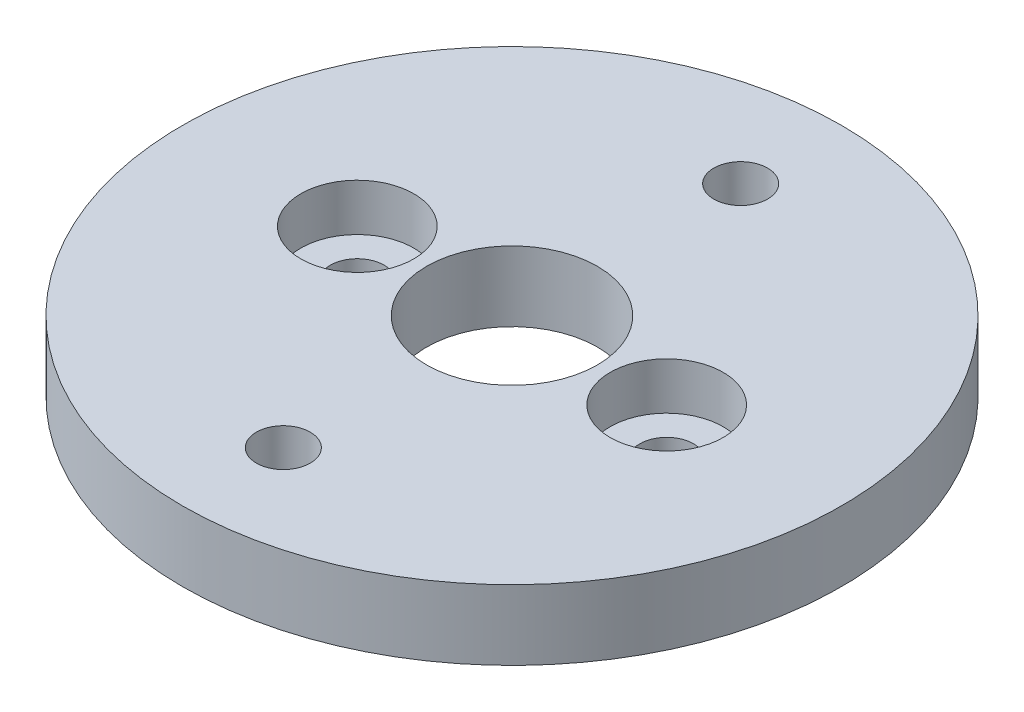
ISO-10303-21;
HEADER;
FILE_DESCRIPTION(('STEP AP214'),'2;1');
FILE_NAME('part.step','',(''),(''),'','','');
FILE_SCHEMA(('AUTOMOTIVE_DESIGN { 1 0 10303 214 1 1 1 1 }'));
ENDSEC;
DATA;
#1=APPLICATION_CONTEXT('core data for automotive mechanical design processes');
#2=APPLICATION_PROTOCOL_DEFINITION('international standard','automotive_design',2000,#1);
#3=PRODUCT_CONTEXT('',#1,'mechanical');
#4=PRODUCT('Part','Part','',(#3));
#5=PRODUCT_RELATED_PRODUCT_CATEGORY('part','',(#4));
#6=PRODUCT_DEFINITION_FORMATION('','',#4);
#7=PRODUCT_DEFINITION_CONTEXT('part definition',#1,'design');
#8=PRODUCT_DEFINITION('design','',#6,#7);
#9=PRODUCT_DEFINITION_SHAPE('','',#8);
#10=(LENGTH_UNIT() NAMED_UNIT(*) SI_UNIT(.MILLI.,.METRE.));
#11=(NAMED_UNIT(*) PLANE_ANGLE_UNIT() SI_UNIT($,.RADIAN.));
#12=(NAMED_UNIT(*) SI_UNIT($,.STERADIAN.) SOLID_ANGLE_UNIT());
#13=UNCERTAINTY_MEASURE_WITH_UNIT(LENGTH_MEASURE(1.E-05),#10,'distance_accuracy_value','');
#14=(GEOMETRIC_REPRESENTATION_CONTEXT(3) GLOBAL_UNCERTAINTY_ASSIGNED_CONTEXT((#13)) GLOBAL_UNIT_ASSIGNED_CONTEXT((#10,
#11,#12)) REPRESENTATION_CONTEXT('',''));
#15=CARTESIAN_POINT('',(0.,0.,0.));
#16=DIRECTION('',(0.,0.,1.));
#17=DIRECTION('',(1.,0.,0.));
#18=AXIS2_PLACEMENT_3D('',#15,#16,#17);
#19=CARTESIAN_POINT('',(-5.75,2.601,0.));
#20=DIRECTION('',(0.,-1.,0.));
#21=DIRECTION('',(0.,0.,-1.));
#22=AXIS2_PLACEMENT_3D('',#19,#20,#21);
#23=CYLINDRICAL_SURFACE('',#22,1.);
#24=CARTESIAN_POINT('',(-5.75,0.,0.));
#25=DIRECTION('',(0.,-1.,0.));
#26=DIRECTION('',(0.,0.,-1.));
#27=AXIS2_PLACEMENT_3D('',#24,#25,#26);
#28=CIRCLE('',#27,1.);
#29=CARTESIAN_POINT('',(-5.75,0.,-1.));
#30=VERTEX_POINT('',#29);
#31=EDGE_CURVE('E61',#30,#30,#28,.T.);
#32=ORIENTED_EDGE('',*,*,#31,.T.);
#33=EDGE_LOOP('',(#32));
#34=FACE_BOUND('',#33,.T.);
#35=CARTESIAN_POINT('',(-5.75,0.85,0.));
#36=DIRECTION('',(0.,1.,0.));
#37=DIRECTION('',(0.,0.,1.));
#38=AXIS2_PLACEMENT_3D('',#35,#36,#37);
#39=CIRCLE('',#38,1.);
#40=CARTESIAN_POINT('',(-5.75,0.85,0.999999999999999));
#41=VERTEX_POINT('',#40);
#42=EDGE_CURVE('E41',#41,#41,#39,.F.);
#43=ORIENTED_EDGE('',*,*,#42,.F.);
#44=EDGE_LOOP('',(#43));
#45=FACE_BOUND('',#44,.T.);
#46=ADVANCED_FACE('F37',(#34,#45),#23,.F.);
#47=CARTESIAN_POINT('',(5.75,2.601,0.));
#48=DIRECTION('',(0.,-1.,0.));
#49=DIRECTION('',(0.,0.,-1.));
#50=AXIS2_PLACEMENT_3D('',#47,#48,#49);
#51=CYLINDRICAL_SURFACE('',#50,1.);
#52=CARTESIAN_POINT('',(5.75,0.,0.));
#53=DIRECTION('',(0.,-1.,0.));
#54=DIRECTION('',(0.,0.,-1.));
#55=AXIS2_PLACEMENT_3D('',#52,#53,#54);
#56=CIRCLE('',#55,1.);
#57=CARTESIAN_POINT('',(5.75,0.,-0.999999999999998));
#58=VERTEX_POINT('',#57);
#59=EDGE_CURVE('E76',#58,#58,#56,.T.);
#60=ORIENTED_EDGE('',*,*,#59,.T.);
#61=EDGE_LOOP('',(#60));
#62=FACE_BOUND('',#61,.T.);
#63=CARTESIAN_POINT('',(5.75,0.85,0.));
#64=DIRECTION('',(0.,1.,0.));
#65=DIRECTION('',(0.,0.,1.));
#66=AXIS2_PLACEMENT_3D('',#63,#64,#65);
#67=CIRCLE('',#66,1.);
#68=CARTESIAN_POINT('',(5.75,0.85,1.));
#69=VERTEX_POINT('',#68);
#70=EDGE_CURVE('E55',#69,#69,#67,.F.);
#71=ORIENTED_EDGE('',*,*,#70,.F.);
#72=EDGE_LOOP('',(#71));
#73=FACE_BOUND('',#72,.T.);
#74=ADVANCED_FACE('F115',(#62,#73),#51,.F.);
#75=CARTESIAN_POINT('',(0.,2.6,0.));
#76=DIRECTION('',(0.,-1.,0.));
#77=DIRECTION('',(0.,0.,-1.));
#78=AXIS2_PLACEMENT_3D('',#75,#76,#77);
#79=CYLINDRICAL_SURFACE('',#78,12.25);
#80=CARTESIAN_POINT('',(0.,2.6,0.));
#81=DIRECTION('',(0.,1.,0.));
#82=DIRECTION('',(0.,0.,1.));
#83=AXIS2_PLACEMENT_3D('',#80,#81,#82);
#84=CIRCLE('',#83,12.25);
#85=CARTESIAN_POINT('',(0.,2.6,12.25));
#86=VERTEX_POINT('',#85);
#87=EDGE_CURVE('E10',#86,#86,#84,.T.);
#88=ORIENTED_EDGE('',*,*,#87,.F.);
#89=EDGE_LOOP('',(#88));
#90=FACE_BOUND('',#89,.T.);
#91=CARTESIAN_POINT('',(0.,0.,0.));
#92=DIRECTION('',(0.,1.,0.));
#93=DIRECTION('',(0.,0.,1.));
#94=AXIS2_PLACEMENT_3D('',#91,#92,#93);
#95=CIRCLE('',#94,12.25);
#96=CARTESIAN_POINT('',(0.,0.,12.25));
#97=VERTEX_POINT('',#96);
#98=EDGE_CURVE('E45',#97,#97,#95,.T.);
#99=ORIENTED_EDGE('',*,*,#98,.T.);
#100=EDGE_LOOP('',(#99));
#101=FACE_BOUND('',#100,.T.);
#102=ADVANCED_FACE('F39',(#90,#101),#79,.T.);
#103=CARTESIAN_POINT('',(0.,2.6,0.));
#104=DIRECTION('',(0.,1.,0.));
#105=DIRECTION('',(0.,0.,1.));
#106=AXIS2_PLACEMENT_3D('',#103,#104,#105);
#107=PLANE('',#106);
#108=CARTESIAN_POINT('',(-5.75,2.6,0.));
#109=DIRECTION('',(0.,1.,0.));
#110=DIRECTION('',(0.,0.,1.));
#111=AXIS2_PLACEMENT_3D('',#108,#109,#110);
#112=CIRCLE('',#111,2.1);
#113=CARTESIAN_POINT('',(-5.75,2.6,2.1));
#114=VERTEX_POINT('',#113);
#115=EDGE_CURVE('E63',#114,#114,#112,.T.);
#116=ORIENTED_EDGE('',*,*,#115,.F.);
#117=EDGE_LOOP('',(#116));
#118=FACE_BOUND('',#117,.T.);
#119=CARTESIAN_POINT('',(5.75,2.6,0.));
#120=DIRECTION('',(0.,1.,0.));
#121=DIRECTION('',(0.,0.,1.));
#122=AXIS2_PLACEMENT_3D('',#119,#120,#121);
#123=CIRCLE('',#122,2.1);
#124=CARTESIAN_POINT('',(5.75,2.6,2.1));
#125=VERTEX_POINT('',#124);
#126=EDGE_CURVE('E68',#125,#125,#123,.T.);
#127=ORIENTED_EDGE('',*,*,#126,.F.);
#128=EDGE_LOOP('',(#127));
#129=FACE_BOUND('',#128,.T.);
#130=CARTESIAN_POINT('',(0.,2.6,8.50000000000001));
#131=DIRECTION('',(0.,1.,0.));
#132=DIRECTION('',(0.,0.,1.));
#133=AXIS2_PLACEMENT_3D('',#130,#131,#132);
#134=CIRCLE('',#133,0.999999999999999);
#135=CARTESIAN_POINT('',(0.,2.6,9.50000000000001));
#136=VERTEX_POINT('',#135);
#137=EDGE_CURVE('E82',#136,#136,#134,.F.);
#138=ORIENTED_EDGE('',*,*,#137,.T.);
#139=EDGE_LOOP('',(#138));
#140=FACE_BOUND('',#139,.T.);
#141=CARTESIAN_POINT('',(0.,2.6,-8.49999999999999));
#142=DIRECTION('',(0.,1.,0.));
#143=DIRECTION('',(0.,0.,1.));
#144=AXIS2_PLACEMENT_3D('',#141,#142,#143);
#145=CIRCLE('',#144,0.999999999999999);
#146=CARTESIAN_POINT('',(0.,2.6,-7.5));
#147=VERTEX_POINT('',#146);
#148=EDGE_CURVE('E88',#147,#147,#145,.F.);
#149=ORIENTED_EDGE('',*,*,#148,.T.);
#150=EDGE_LOOP('',(#149));
#151=FACE_BOUND('',#150,.T.);
#152=CARTESIAN_POINT('',(0.,2.6,0.));
#153=DIRECTION('',(0.,1.,0.));
#154=DIRECTION('',(0.,0.,1.));
#155=AXIS2_PLACEMENT_3D('',#152,#153,#154);
#156=CIRCLE('',#155,3.175);
#157=CARTESIAN_POINT('',(0.,2.6,3.175));
#158=VERTEX_POINT('',#157);
#159=EDGE_CURVE('E53',#158,#158,#156,.F.);
#160=ORIENTED_EDGE('',*,*,#159,.T.);
#161=EDGE_LOOP('',(#160));
#162=FACE_BOUND('',#161,.T.);
#163=ORIENTED_EDGE('',*,*,#87,.T.);
#164=EDGE_LOOP('',(#163));
#165=FACE_BOUND('',#164,.T.);
#166=ADVANCED_FACE('F98',(#118,#129,#140,#151,#162,#165),#107,.T.);
#167=CARTESIAN_POINT('',(0.,0.,0.));
#168=DIRECTION('',(0.,1.,0.));
#169=DIRECTION('',(0.,0.,1.));
#170=AXIS2_PLACEMENT_3D('',#167,#168,#169);
#171=PLANE('',#170);
#172=CARTESIAN_POINT('',(0.,0.,8.50000000000001));
#173=DIRECTION('',(0.,-1.,0.));
#174=DIRECTION('',(0.,0.,-1.));
#175=AXIS2_PLACEMENT_3D('',#172,#173,#174);
#176=CIRCLE('',#175,0.999999999999999);
#177=CARTESIAN_POINT('',(0.,0.,7.50000000000001));
#178=VERTEX_POINT('',#177);
#179=EDGE_CURVE('E85',#178,#178,#176,.T.);
#180=ORIENTED_EDGE('',*,*,#179,.F.);
#181=EDGE_LOOP('',(#180));
#182=FACE_BOUND('',#181,.T.);
#183=CARTESIAN_POINT('',(0.,0.,-8.49999999999999));
#184=DIRECTION('',(0.,-1.,0.));
#185=DIRECTION('',(0.,0.,-1.));
#186=AXIS2_PLACEMENT_3D('',#183,#184,#185);
#187=CIRCLE('',#186,0.999999999999999);
#188=CARTESIAN_POINT('',(0.,0.,-9.49999999999999));
#189=VERTEX_POINT('',#188);
#190=EDGE_CURVE('E79',#189,#189,#187,.T.);
#191=ORIENTED_EDGE('',*,*,#190,.F.);
#192=EDGE_LOOP('',(#191));
#193=FACE_BOUND('',#192,.T.);
#194=ORIENTED_EDGE('',*,*,#59,.F.);
#195=EDGE_LOOP('',(#194));
#196=FACE_BOUND('',#195,.T.);
#197=ORIENTED_EDGE('',*,*,#31,.F.);
#198=EDGE_LOOP('',(#197));
#199=FACE_BOUND('',#198,.T.);
#200=CARTESIAN_POINT('',(0.,0.,0.));
#201=DIRECTION('',(0.,-1.,0.));
#202=DIRECTION('',(0.,0.,-1.));
#203=AXIS2_PLACEMENT_3D('',#200,#201,#202);
#204=CIRCLE('',#203,3.175);
#205=CARTESIAN_POINT('',(0.,0.,-3.175));
#206=VERTEX_POINT('',#205);
#207=EDGE_CURVE('E50',#206,#206,#204,.T.);
#208=ORIENTED_EDGE('',*,*,#207,.F.);
#209=EDGE_LOOP('',(#208));
#210=FACE_BOUND('',#209,.T.);
#211=ORIENTED_EDGE('',*,*,#98,.F.);
#212=EDGE_LOOP('',(#211));
#213=FACE_BOUND('',#212,.T.);
#214=ADVANCED_FACE('F103',(#182,#193,#196,#199,#210,#213),#171,.F.);
#215=CARTESIAN_POINT('',(0.,2.601,0.));
#216=DIRECTION('',(0.,-1.,0.));
#217=DIRECTION('',(0.,0.,-1.));
#218=AXIS2_PLACEMENT_3D('',#215,#216,#217);
#219=CYLINDRICAL_SURFACE('',#218,3.175);
#220=ORIENTED_EDGE('',*,*,#159,.F.);
#221=EDGE_LOOP('',(#220));
#222=FACE_BOUND('',#221,.T.);
#223=ORIENTED_EDGE('',*,*,#207,.T.);
#224=EDGE_LOOP('',(#223));
#225=FACE_BOUND('',#224,.T.);
#226=ADVANCED_FACE('F100',(#222,#225),#219,.F.);
#227=CARTESIAN_POINT('',(0.,2.601,-8.49999999999999));
#228=DIRECTION('',(0.,-1.,0.));
#229=DIRECTION('',(0.,0.,-1.));
#230=AXIS2_PLACEMENT_3D('',#227,#228,#229);
#231=CYLINDRICAL_SURFACE('',#230,0.999999999999999);
#232=ORIENTED_EDGE('',*,*,#148,.F.);
#233=EDGE_LOOP('',(#232));
#234=FACE_BOUND('',#233,.T.);
#235=ORIENTED_EDGE('',*,*,#190,.T.);
#236=EDGE_LOOP('',(#235));
#237=FACE_BOUND('',#236,.T.);
#238=ADVANCED_FACE('F102',(#234,#237),#231,.F.);
#239=CARTESIAN_POINT('',(0.,2.601,8.50000000000001));
#240=DIRECTION('',(0.,-1.,0.));
#241=DIRECTION('',(0.,0.,-1.));
#242=AXIS2_PLACEMENT_3D('',#239,#240,#241);
#243=CYLINDRICAL_SURFACE('',#242,0.999999999999999);
#244=ORIENTED_EDGE('',*,*,#137,.F.);
#245=EDGE_LOOP('',(#244));
#246=FACE_BOUND('',#245,.T.);
#247=ORIENTED_EDGE('',*,*,#179,.T.);
#248=EDGE_LOOP('',(#247));
#249=FACE_BOUND('',#248,.T.);
#250=ADVANCED_FACE('F109',(#246,#249),#243,.F.);
#251=CARTESIAN_POINT('',(5.75,0.85,0.));
#252=DIRECTION('',(0.,1.,0.));
#253=DIRECTION('',(0.,0.,1.));
#254=AXIS2_PLACEMENT_3D('',#251,#252,#253);
#255=PLANE('',#254);
#256=CARTESIAN_POINT('',(5.75,0.85,0.));
#257=DIRECTION('',(0.,1.,0.));
#258=DIRECTION('',(0.,0.,1.));
#259=AXIS2_PLACEMENT_3D('',#256,#257,#258);
#260=CIRCLE('',#259,2.1);
#261=CARTESIAN_POINT('',(5.75,0.85,2.1));
#262=VERTEX_POINT('',#261);
#263=EDGE_CURVE('E73',#262,#262,#260,.T.);
#264=ORIENTED_EDGE('',*,*,#263,.T.);
#265=EDGE_LOOP('',(#264));
#266=FACE_BOUND('',#265,.T.);
#267=ORIENTED_EDGE('',*,*,#70,.T.);
#268=EDGE_LOOP('',(#267));
#269=FACE_BOUND('',#268,.T.);
#270=ADVANCED_FACE('F127',(#266,#269),#255,.T.);
#271=CARTESIAN_POINT('',(5.75,0.85,0.));
#272=DIRECTION('',(0.,1.,0.));
#273=DIRECTION('',(0.,0.,1.));
#274=AXIS2_PLACEMENT_3D('',#271,#272,#273);
#275=CYLINDRICAL_SURFACE('',#274,2.1);
#276=ORIENTED_EDGE('',*,*,#263,.F.);
#277=EDGE_LOOP('',(#276));
#278=FACE_BOUND('',#277,.T.);
#279=ORIENTED_EDGE('',*,*,#126,.T.);
#280=EDGE_LOOP('',(#279));
#281=FACE_BOUND('',#280,.T.);
#282=ADVANCED_FACE('F132',(#278,#281),#275,.F.);
#283=CARTESIAN_POINT('',(-5.75,0.85,0.));
#284=DIRECTION('',(0.,1.,0.));
#285=DIRECTION('',(0.,0.,1.));
#286=AXIS2_PLACEMENT_3D('',#283,#284,#285);
#287=PLANE('',#286);
#288=CARTESIAN_POINT('',(-5.75,0.85,0.));
#289=DIRECTION('',(0.,1.,0.));
#290=DIRECTION('',(0.,0.,1.));
#291=AXIS2_PLACEMENT_3D('',#288,#289,#290);
#292=CIRCLE('',#291,2.1);
#293=CARTESIAN_POINT('',(-5.75,0.85,2.1));
#294=VERTEX_POINT('',#293);
#295=EDGE_CURVE('E57',#294,#294,#292,.T.);
#296=ORIENTED_EDGE('',*,*,#295,.T.);
#297=EDGE_LOOP('',(#296));
#298=FACE_BOUND('',#297,.T.);
#299=ORIENTED_EDGE('',*,*,#42,.T.);
#300=EDGE_LOOP('',(#299));
#301=FACE_BOUND('',#300,.T.);
#302=ADVANCED_FACE('F164',(#298,#301),#287,.T.);
#303=CARTESIAN_POINT('',(-5.75,0.85,0.));
#304=DIRECTION('',(0.,1.,0.));
#305=DIRECTION('',(0.,0.,1.));
#306=AXIS2_PLACEMENT_3D('',#303,#304,#305);
#307=CYLINDRICAL_SURFACE('',#306,2.1);
#308=ORIENTED_EDGE('',*,*,#295,.F.);
#309=EDGE_LOOP('',(#308));
#310=FACE_BOUND('',#309,.T.);
#311=ORIENTED_EDGE('',*,*,#115,.T.);
#312=EDGE_LOOP('',(#311));
#313=FACE_BOUND('',#312,.T.);
#314=ADVANCED_FACE('F170',(#310,#313),#307,.F.);
#315=CLOSED_SHELL('',(#46,#74,#102,#166,#214,#226,#238,#250,#270,#282,#302,#314));
#316=MANIFOLD_SOLID_BREP('B2',#315);
#317=ADVANCED_BREP_SHAPE_REPRESENTATION('',(#18,#316),#14);
#318=SHAPE_DEFINITION_REPRESENTATION(#9,#317);
ENDSEC;
END-ISO-10303-21;
